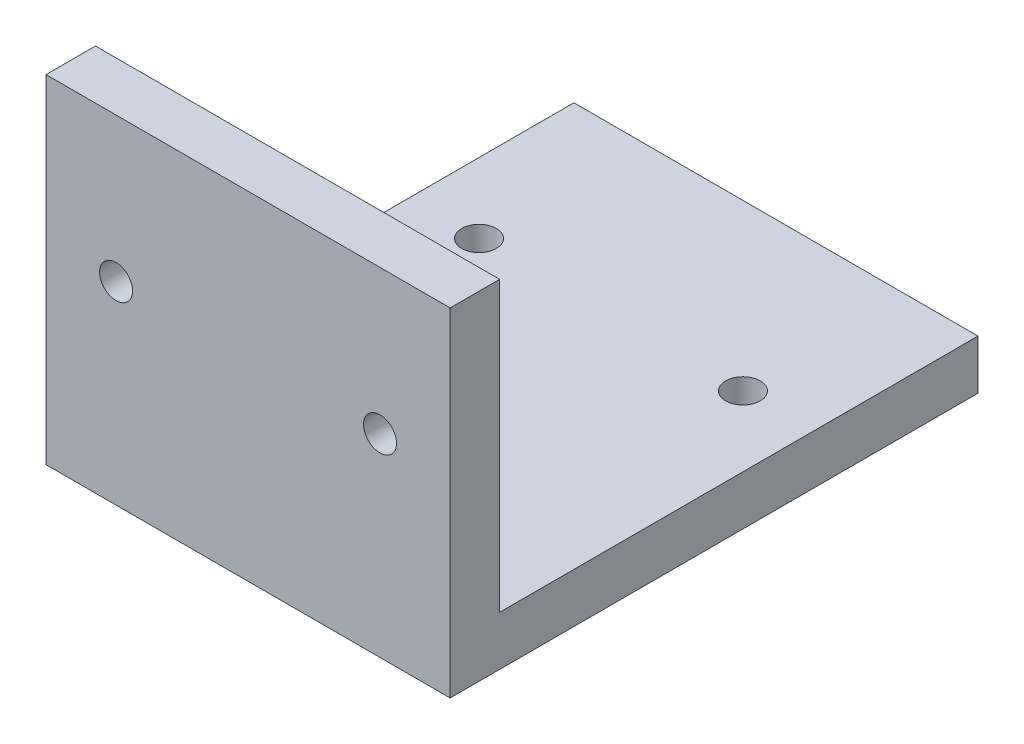
ISO-10303-21;
HEADER;
FILE_DESCRIPTION(('STEP AP214'),'2;1');
FILE_NAME('part.step','',(''),(''),'','','');
FILE_SCHEMA(('AUTOMOTIVE_DESIGN { 1 0 10303 214 1 1 1 1 }'));
ENDSEC;
DATA;
#1=APPLICATION_CONTEXT('core data for automotive mechanical design processes');
#2=APPLICATION_PROTOCOL_DEFINITION('international standard','automotive_design',2000,#1);
#3=PRODUCT_CONTEXT('',#1,'mechanical');
#4=PRODUCT('Part','Part','',(#3));
#5=PRODUCT_RELATED_PRODUCT_CATEGORY('part','',(#4));
#6=PRODUCT_DEFINITION_FORMATION('','',#4);
#7=PRODUCT_DEFINITION_CONTEXT('part definition',#1,'design');
#8=PRODUCT_DEFINITION('design','',#6,#7);
#9=PRODUCT_DEFINITION_SHAPE('','',#8);
#10=(LENGTH_UNIT() NAMED_UNIT(*) SI_UNIT(.MILLI.,.METRE.));
#11=(NAMED_UNIT(*) PLANE_ANGLE_UNIT() SI_UNIT($,.RADIAN.));
#12=(NAMED_UNIT(*) SI_UNIT($,.STERADIAN.) SOLID_ANGLE_UNIT());
#13=UNCERTAINTY_MEASURE_WITH_UNIT(LENGTH_MEASURE(1.E-05),#10,'distance_accuracy_value','');
#14=(GEOMETRIC_REPRESENTATION_CONTEXT(3) GLOBAL_UNCERTAINTY_ASSIGNED_CONTEXT((#13)) GLOBAL_UNIT_ASSIGNED_CONTEXT((#10,
#11,#12)) REPRESENTATION_CONTEXT('',''));
#15=CARTESIAN_POINT('',(0.,0.,0.));
#16=DIRECTION('',(0.,0.,1.));
#17=DIRECTION('',(1.,0.,0.));
#18=AXIS2_PLACEMENT_3D('',#15,#16,#17);
#19=CARTESIAN_POINT('',(0.,3.,0.));
#20=DIRECTION('',(0.,1.,0.));
#21=DIRECTION('',(0.,0.,1.));
#22=AXIS2_PLACEMENT_3D('',#19,#20,#21);
#23=PLANE('',#22);
#24=DIRECTION('',(-1.,0.,0.));
#25=VECTOR('',#24,1.);
#26=CARTESIAN_POINT('',(-12.25,3.,13.));
#27=LINE('',#26,#25);
#28=CARTESIAN_POINT('',(12.25,3.,13.));
#29=VERTEX_POINT('',#28);
#30=CARTESIAN_POINT('',(-12.25,3.,13.));
#31=VERTEX_POINT('',#30);
#32=EDGE_CURVE('E55',#29,#31,#27,.T.);
#33=ORIENTED_EDGE('',*,*,#32,.F.);
#34=DIRECTION('',(0.,0.,-1.));
#35=VECTOR('',#34,1.);
#36=CARTESIAN_POINT('',(12.25,3.,-16.));
#37=LINE('',#36,#35);
#38=CARTESIAN_POINT('',(12.25,3.,-16.));
#39=VERTEX_POINT('',#38);
#40=EDGE_CURVE('E94',#29,#39,#37,.T.);
#41=ORIENTED_EDGE('',*,*,#40,.T.);
#42=DIRECTION('',(-1.,0.,0.));
#43=VECTOR('',#42,1.);
#44=CARTESIAN_POINT('',(-12.25,3.,-16.));
#45=LINE('',#44,#43);
#46=CARTESIAN_POINT('',(-12.25,3.,-16.));
#47=VERTEX_POINT('',#46);
#48=EDGE_CURVE('E61',#39,#47,#45,.T.);
#49=ORIENTED_EDGE('',*,*,#48,.T.);
#50=DIRECTION('',(0.,0.,1.));
#51=VECTOR('',#50,1.);
#52=CARTESIAN_POINT('',(-12.25,3.,-16.));
#53=LINE('',#52,#51);
#54=EDGE_CURVE('E106',#47,#31,#53,.T.);
#55=ORIENTED_EDGE('',*,*,#54,.T.);
#56=EDGE_LOOP('',(#33,#41,#49,#55));
#57=FACE_BOUND('',#56,.T.);
#58=CARTESIAN_POINT('',(8.,3.,-6.));
#59=DIRECTION('',(0.,1.,0.));
#60=DIRECTION('',(0.,0.,1.));
#61=AXIS2_PLACEMENT_3D('',#58,#59,#60);
#62=CIRCLE('',#61,1.05);
#63=CARTESIAN_POINT('',(8.,3.,-4.95));
#64=VERTEX_POINT('',#63);
#65=EDGE_CURVE('E112',#64,#64,#62,.T.);
#66=ORIENTED_EDGE('',*,*,#65,.F.);
#67=EDGE_LOOP('',(#66));
#68=FACE_BOUND('',#67,.T.);
#69=CARTESIAN_POINT('',(-8.,3.,-6.));
#70=DIRECTION('',(0.,1.,0.));
#71=DIRECTION('',(0.,0.,1.));
#72=AXIS2_PLACEMENT_3D('',#69,#70,#71);
#73=CIRCLE('',#72,1.05);
#74=CARTESIAN_POINT('',(-8.,3.,-4.95));
#75=VERTEX_POINT('',#74);
#76=EDGE_CURVE('E153',#75,#75,#73,.T.);
#77=ORIENTED_EDGE('',*,*,#76,.F.);
#78=EDGE_LOOP('',(#77));
#79=FACE_BOUND('',#78,.T.);
#80=ADVANCED_FACE('F39',(#57,#68,#79),#23,.T.);
#81=CARTESIAN_POINT('',(0.,0.,0.));
#82=DIRECTION('',(0.,1.,0.));
#83=DIRECTION('',(0.,0.,1.));
#84=AXIS2_PLACEMENT_3D('',#81,#82,#83);
#85=PLANE('',#84);
#86=DIRECTION('',(0.,0.,-1.));
#87=VECTOR('',#86,1.);
#88=CARTESIAN_POINT('',(12.25,0.,-16.));
#89=LINE('',#88,#87);
#90=CARTESIAN_POINT('',(12.25,0.,16.));
#91=VERTEX_POINT('',#90);
#92=CARTESIAN_POINT('',(12.25,0.,-16.));
#93=VERTEX_POINT('',#92);
#94=EDGE_CURVE('E101',#91,#93,#89,.T.);
#95=ORIENTED_EDGE('',*,*,#94,.F.);
#96=DIRECTION('',(1.,0.,0.));
#97=VECTOR('',#96,1.);
#98=CARTESIAN_POINT('',(-12.25,0.,16.));
#99=LINE('',#98,#97);
#100=CARTESIAN_POINT('',(-12.25,0.,16.));
#101=VERTEX_POINT('',#100);
#102=EDGE_CURVE('E81',#101,#91,#99,.T.);
#103=ORIENTED_EDGE('',*,*,#102,.F.);
#104=DIRECTION('',(0.,0.,1.));
#105=VECTOR('',#104,1.);
#106=CARTESIAN_POINT('',(-12.25,0.,-16.));
#107=LINE('',#106,#105);
#108=CARTESIAN_POINT('',(-12.25,0.,-16.));
#109=VERTEX_POINT('',#108);
#110=EDGE_CURVE('E95',#109,#101,#107,.T.);
#111=ORIENTED_EDGE('',*,*,#110,.F.);
#112=DIRECTION('',(-1.,0.,0.));
#113=VECTOR('',#112,1.);
#114=CARTESIAN_POINT('',(-12.25,0.,-16.));
#115=LINE('',#114,#113);
#116=EDGE_CURVE('E110',#93,#109,#115,.T.);
#117=ORIENTED_EDGE('',*,*,#116,.F.);
#118=EDGE_LOOP('',(#95,#103,#111,#117));
#119=FACE_BOUND('',#118,.T.);
#120=CARTESIAN_POINT('',(8.,0.,-6.));
#121=DIRECTION('',(0.,1.,0.));
#122=DIRECTION('',(0.,0.,1.));
#123=AXIS2_PLACEMENT_3D('',#120,#121,#122);
#124=CIRCLE('',#123,1.05);
#125=CARTESIAN_POINT('',(8.,0.,-4.95));
#126=VERTEX_POINT('',#125);
#127=EDGE_CURVE('E118',#126,#126,#124,.T.);
#128=ORIENTED_EDGE('',*,*,#127,.T.);
#129=EDGE_LOOP('',(#128));
#130=FACE_BOUND('',#129,.T.);
#131=CARTESIAN_POINT('',(-8.,0.,-6.));
#132=DIRECTION('',(0.,1.,0.));
#133=DIRECTION('',(0.,0.,1.));
#134=AXIS2_PLACEMENT_3D('',#131,#132,#133);
#135=CIRCLE('',#134,1.05);
#136=CARTESIAN_POINT('',(-8.,0.,-4.95));
#137=VERTEX_POINT('',#136);
#138=EDGE_CURVE('E147',#137,#137,#135,.T.);
#139=ORIENTED_EDGE('',*,*,#138,.T.);
#140=EDGE_LOOP('',(#139));
#141=FACE_BOUND('',#140,.T.);
#142=ADVANCED_FACE('F108',(#119,#130,#141),#85,.F.);
#143=CARTESIAN_POINT('',(12.25,3.,-16.));
#144=DIRECTION('',(-1.,0.,0.));
#145=DIRECTION('',(0.,0.,1.));
#146=AXIS2_PLACEMENT_3D('',#143,#144,#145);
#147=PLANE('',#146);
#148=ORIENTED_EDGE('',*,*,#94,.T.);
#149=DIRECTION('',(0.,-1.,0.));
#150=VECTOR('',#149,1.);
#151=CARTESIAN_POINT('',(12.25,3.,-16.));
#152=LINE('',#151,#150);
#153=EDGE_CURVE('E11',#39,#93,#152,.T.);
#154=ORIENTED_EDGE('',*,*,#153,.F.);
#155=ORIENTED_EDGE('',*,*,#40,.F.);
#156=DIRECTION('',(0.,-1.,0.));
#157=VECTOR('',#156,1.);
#158=CARTESIAN_POINT('',(12.25,20.48,13.));
#159=LINE('',#158,#157);
#160=CARTESIAN_POINT('',(12.25,20.48,13.));
#161=VERTEX_POINT('',#160);
#162=EDGE_CURVE('E136',#161,#29,#159,.T.);
#163=ORIENTED_EDGE('',*,*,#162,.F.);
#164=DIRECTION('',(0.,0.,-1.));
#165=VECTOR('',#164,1.);
#166=CARTESIAN_POINT('',(12.25,20.48,16.));
#167=LINE('',#166,#165);
#168=CARTESIAN_POINT('',(12.25,20.48,16.));
#169=VERTEX_POINT('',#168);
#170=EDGE_CURVE('E104',#169,#161,#167,.T.);
#171=ORIENTED_EDGE('',*,*,#170,.F.);
#172=DIRECTION('',(0.,-1.,0.));
#173=VECTOR('',#172,1.);
#174=CARTESIAN_POINT('',(12.25,3.,16.));
#175=LINE('',#174,#173);
#176=EDGE_CURVE('E86',#169,#91,#175,.T.);
#177=ORIENTED_EDGE('',*,*,#176,.T.);
#178=EDGE_LOOP('',(#148,#154,#155,#163,#171,#177));
#179=FACE_BOUND('',#178,.T.);
#180=ADVANCED_FACE('F41',(#179),#147,.F.);
#181=CARTESIAN_POINT('',(-12.25,3.,-16.));
#182=DIRECTION('',(0.,0.,1.));
#183=DIRECTION('',(1.,0.,0.));
#184=AXIS2_PLACEMENT_3D('',#181,#182,#183);
#185=PLANE('',#184);
#186=ORIENTED_EDGE('',*,*,#116,.T.);
#187=DIRECTION('',(0.,-1.,0.));
#188=VECTOR('',#187,1.);
#189=CARTESIAN_POINT('',(-12.25,3.,-16.));
#190=LINE('',#189,#188);
#191=EDGE_CURVE('E48',#47,#109,#190,.T.);
#192=ORIENTED_EDGE('',*,*,#191,.F.);
#193=ORIENTED_EDGE('',*,*,#48,.F.);
#194=ORIENTED_EDGE('',*,*,#153,.T.);
#195=EDGE_LOOP('',(#186,#192,#193,#194));
#196=FACE_BOUND('',#195,.T.);
#197=ADVANCED_FACE('F133',(#196),#185,.F.);
#198=CARTESIAN_POINT('',(-12.25,3.,-16.));
#199=DIRECTION('',(1.,0.,0.));
#200=DIRECTION('',(0.,0.,-1.));
#201=AXIS2_PLACEMENT_3D('',#198,#199,#200);
#202=PLANE('',#201);
#203=ORIENTED_EDGE('',*,*,#110,.T.);
#204=DIRECTION('',(0.,-1.,0.));
#205=VECTOR('',#204,1.);
#206=CARTESIAN_POINT('',(-12.25,3.,16.));
#207=LINE('',#206,#205);
#208=CARTESIAN_POINT('',(-12.25,20.48,16.));
#209=VERTEX_POINT('',#208);
#210=EDGE_CURVE('E89',#209,#101,#207,.T.);
#211=ORIENTED_EDGE('',*,*,#210,.F.);
#212=DIRECTION('',(0.,0.,1.));
#213=VECTOR('',#212,1.);
#214=CARTESIAN_POINT('',(-12.25,20.48,16.));
#215=LINE('',#214,#213);
#216=CARTESIAN_POINT('',(-12.25,20.48,13.));
#217=VERTEX_POINT('',#216);
#218=EDGE_CURVE('E180',#217,#209,#215,.T.);
#219=ORIENTED_EDGE('',*,*,#218,.F.);
#220=DIRECTION('',(0.,-1.,0.));
#221=VECTOR('',#220,1.);
#222=CARTESIAN_POINT('',(-12.25,20.48,13.));
#223=LINE('',#222,#221);
#224=EDGE_CURVE('E148',#217,#31,#223,.T.);
#225=ORIENTED_EDGE('',*,*,#224,.T.);
#226=ORIENTED_EDGE('',*,*,#54,.F.);
#227=ORIENTED_EDGE('',*,*,#191,.T.);
#228=EDGE_LOOP('',(#203,#211,#219,#225,#226,#227));
#229=FACE_BOUND('',#228,.T.);
#230=ADVANCED_FACE('F130',(#229),#202,.F.);
#231=CARTESIAN_POINT('',(-12.25,3.,16.));
#232=DIRECTION('',(0.,0.,-1.));
#233=DIRECTION('',(-1.,0.,0.));
#234=AXIS2_PLACEMENT_3D('',#231,#232,#233);
#235=PLANE('',#234);
#236=CARTESIAN_POINT('',(-8.,11.74,16.));
#237=DIRECTION('',(0.,0.,-1.));
#238=DIRECTION('',(-1.,0.,0.));
#239=AXIS2_PLACEMENT_3D('',#236,#237,#238);
#240=CIRCLE('',#239,1.);
#241=CARTESIAN_POINT('',(-9.,11.74,16.));
#242=VERTEX_POINT('',#241);
#243=EDGE_CURVE('E184',#242,#242,#240,.T.);
#244=ORIENTED_EDGE('',*,*,#243,.T.);
#245=EDGE_LOOP('',(#244));
#246=FACE_BOUND('',#245,.T.);
#247=CARTESIAN_POINT('',(8.,11.74,16.));
#248=DIRECTION('',(0.,0.,-1.));
#249=DIRECTION('',(-1.,0.,0.));
#250=AXIS2_PLACEMENT_3D('',#247,#248,#249);
#251=CIRCLE('',#250,1.);
#252=CARTESIAN_POINT('',(7.,11.74,16.));
#253=VERTEX_POINT('',#252);
#254=EDGE_CURVE('E188',#253,#253,#251,.T.);
#255=ORIENTED_EDGE('',*,*,#254,.T.);
#256=EDGE_LOOP('',(#255));
#257=FACE_BOUND('',#256,.T.);
#258=ORIENTED_EDGE('',*,*,#102,.T.);
#259=ORIENTED_EDGE('',*,*,#176,.F.);
#260=DIRECTION('',(1.,0.,0.));
#261=VECTOR('',#260,1.);
#262=CARTESIAN_POINT('',(-12.25,20.48,16.));
#263=LINE('',#262,#261);
#264=EDGE_CURVE('E174',#209,#169,#263,.T.);
#265=ORIENTED_EDGE('',*,*,#264,.F.);
#266=ORIENTED_EDGE('',*,*,#210,.T.);
#267=EDGE_LOOP('',(#258,#259,#265,#266));
#268=FACE_BOUND('',#267,.T.);
#269=ADVANCED_FACE('F83',(#246,#257,#268),#235,.F.);
#270=CARTESIAN_POINT('',(8.,3.,-6.));
#271=DIRECTION('',(0.,-1.,0.));
#272=DIRECTION('',(0.,0.,-1.));
#273=AXIS2_PLACEMENT_3D('',#270,#271,#272);
#274=CYLINDRICAL_SURFACE('',#273,1.05);
#275=ORIENTED_EDGE('',*,*,#65,.T.);
#276=EDGE_LOOP('',(#275));
#277=FACE_BOUND('',#276,.T.);
#278=ORIENTED_EDGE('',*,*,#127,.F.);
#279=EDGE_LOOP('',(#278));
#280=FACE_BOUND('',#279,.T.);
#281=ADVANCED_FACE('F221',(#277,#280),#274,.F.);
#282=CARTESIAN_POINT('',(-8.,3.,-6.));
#283=DIRECTION('',(0.,-1.,0.));
#284=DIRECTION('',(0.,0.,-1.));
#285=AXIS2_PLACEMENT_3D('',#282,#283,#284);
#286=CYLINDRICAL_SURFACE('',#285,1.05);
#287=ORIENTED_EDGE('',*,*,#76,.T.);
#288=EDGE_LOOP('',(#287));
#289=FACE_BOUND('',#288,.T.);
#290=ORIENTED_EDGE('',*,*,#138,.F.);
#291=EDGE_LOOP('',(#290));
#292=FACE_BOUND('',#291,.T.);
#293=ADVANCED_FACE('F210',(#289,#292),#286,.F.);
#294=CARTESIAN_POINT('',(-12.25,20.48,13.));
#295=DIRECTION('',(0.,0.,1.));
#296=DIRECTION('',(1.,0.,0.));
#297=AXIS2_PLACEMENT_3D('',#294,#295,#296);
#298=PLANE('',#297);
#299=CARTESIAN_POINT('',(-8.,11.74,13.));
#300=DIRECTION('',(0.,0.,-1.));
#301=DIRECTION('',(-1.,0.,0.));
#302=AXIS2_PLACEMENT_3D('',#299,#300,#301);
#303=CIRCLE('',#302,1.);
#304=CARTESIAN_POINT('',(-9.,11.74,13.));
#305=VERTEX_POINT('',#304);
#306=EDGE_CURVE('E194',#305,#305,#303,.T.);
#307=ORIENTED_EDGE('',*,*,#306,.F.);
#308=EDGE_LOOP('',(#307));
#309=FACE_BOUND('',#308,.T.);
#310=CARTESIAN_POINT('',(8.,11.74,13.));
#311=DIRECTION('',(0.,0.,-1.));
#312=DIRECTION('',(1.,0.,0.));
#313=AXIS2_PLACEMENT_3D('',#310,#311,#312);
#314=CIRCLE('',#313,1.);
#315=CARTESIAN_POINT('',(9.,11.74,13.));
#316=VERTEX_POINT('',#315);
#317=EDGE_CURVE('E197',#316,#316,#314,.T.);
#318=ORIENTED_EDGE('',*,*,#317,.F.);
#319=EDGE_LOOP('',(#318));
#320=FACE_BOUND('',#319,.T.);
#321=ORIENTED_EDGE('',*,*,#32,.T.);
#322=ORIENTED_EDGE('',*,*,#224,.F.);
#323=DIRECTION('',(-1.,0.,0.));
#324=VECTOR('',#323,1.);
#325=CARTESIAN_POINT('',(-12.25,20.48,13.));
#326=LINE('',#325,#324);
#327=EDGE_CURVE('E145',#161,#217,#326,.T.);
#328=ORIENTED_EDGE('',*,*,#327,.F.);
#329=ORIENTED_EDGE('',*,*,#162,.T.);
#330=EDGE_LOOP('',(#321,#322,#328,#329));
#331=FACE_BOUND('',#330,.T.);
#332=ADVANCED_FACE('F141',(#309,#320,#331),#298,.F.);
#333=CARTESIAN_POINT('',(0.,20.48,0.));
#334=DIRECTION('',(0.,-1.,0.));
#335=DIRECTION('',(0.,0.,-1.));
#336=AXIS2_PLACEMENT_3D('',#333,#334,#335);
#337=PLANE('',#336);
#338=ORIENTED_EDGE('',*,*,#218,.T.);
#339=ORIENTED_EDGE('',*,*,#264,.T.);
#340=ORIENTED_EDGE('',*,*,#170,.T.);
#341=ORIENTED_EDGE('',*,*,#327,.T.);
#342=EDGE_LOOP('',(#338,#339,#340,#341));
#343=FACE_BOUND('',#342,.T.);
#344=ADVANCED_FACE('F173',(#343),#337,.F.);
#345=CARTESIAN_POINT('',(8.,11.74,23.));
#346=DIRECTION('',(0.,0.,-1.));
#347=DIRECTION('',(-1.,0.,0.));
#348=AXIS2_PLACEMENT_3D('',#345,#346,#347);
#349=CYLINDRICAL_SURFACE('',#348,1.);
#350=ORIENTED_EDGE('',*,*,#317,.T.);
#351=EDGE_LOOP('',(#350));
#352=FACE_BOUND('',#351,.T.);
#353=ORIENTED_EDGE('',*,*,#254,.F.);
#354=EDGE_LOOP('',(#353));
#355=FACE_BOUND('',#354,.T.);
#356=ADVANCED_FACE('F214',(#352,#355),#349,.F.);
#357=CARTESIAN_POINT('',(-8.,11.74,23.));
#358=DIRECTION('',(0.,0.,-1.));
#359=DIRECTION('',(-1.,0.,0.));
#360=AXIS2_PLACEMENT_3D('',#357,#358,#359);
#361=CYLINDRICAL_SURFACE('',#360,1.);
#362=ORIENTED_EDGE('',*,*,#306,.T.);
#363=EDGE_LOOP('',(#362));
#364=FACE_BOUND('',#363,.T.);
#365=ORIENTED_EDGE('',*,*,#243,.F.);
#366=EDGE_LOOP('',(#365));
#367=FACE_BOUND('',#366,.T.);
#368=ADVANCED_FACE('F205',(#364,#367),#361,.F.);
#369=CLOSED_SHELL('',(#80,#142,#180,#197,#230,#269,#281,#293,#332,#344,#356,#368));
#370=MANIFOLD_SOLID_BREP('B2',#369);
#371=ADVANCED_BREP_SHAPE_REPRESENTATION('',(#18,#370),#14);
#372=SHAPE_DEFINITION_REPRESENTATION(#9,#371);
ENDSEC;
END-ISO-10303-21;
